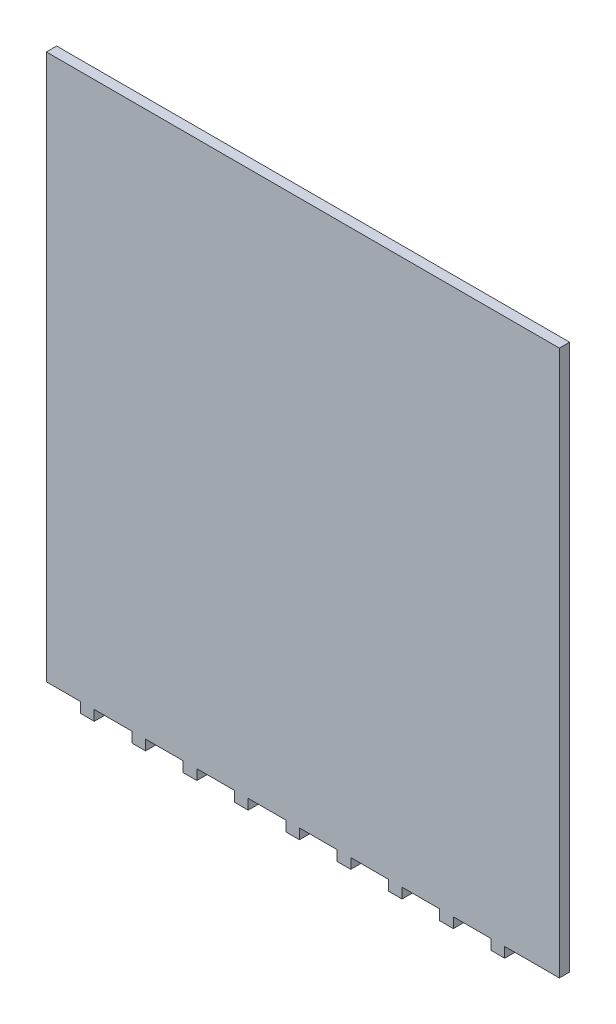
ISO-10303-21;
HEADER;
FILE_DESCRIPTION(('STEP AP214'),'2;1');
FILE_NAME('part.step','',(''),(''),'','','');
FILE_SCHEMA(('AUTOMOTIVE_DESIGN { 1 0 10303 214 1 1 1 1 }'));
ENDSEC;
DATA;
#1=APPLICATION_CONTEXT('core data for automotive mechanical design processes');
#2=APPLICATION_PROTOCOL_DEFINITION('international standard','automotive_design',2000,#1);
#3=PRODUCT_CONTEXT('',#1,'mechanical');
#4=PRODUCT('Part','Part','',(#3));
#5=PRODUCT_RELATED_PRODUCT_CATEGORY('part','',(#4));
#6=PRODUCT_DEFINITION_FORMATION('','',#4);
#7=PRODUCT_DEFINITION_CONTEXT('part definition',#1,'design');
#8=PRODUCT_DEFINITION('design','',#6,#7);
#9=PRODUCT_DEFINITION_SHAPE('','',#8);
#10=(LENGTH_UNIT() NAMED_UNIT(*) SI_UNIT(.MILLI.,.METRE.));
#11=(NAMED_UNIT(*) PLANE_ANGLE_UNIT() SI_UNIT($,.RADIAN.));
#12=(NAMED_UNIT(*) SI_UNIT($,.STERADIAN.) SOLID_ANGLE_UNIT());
#13=UNCERTAINTY_MEASURE_WITH_UNIT(LENGTH_MEASURE(1.E-05),#10,'distance_accuracy_value','');
#14=(GEOMETRIC_REPRESENTATION_CONTEXT(3) GLOBAL_UNCERTAINTY_ASSIGNED_CONTEXT((#13)) GLOBAL_UNIT_ASSIGNED_CONTEXT((#10,
#11,#12)) REPRESENTATION_CONTEXT('',''));
#15=CARTESIAN_POINT('',(0.,0.,0.));
#16=DIRECTION('',(0.,0.,1.));
#17=DIRECTION('',(1.,0.,0.));
#18=AXIS2_PLACEMENT_3D('',#15,#16,#17);
#19=CARTESIAN_POINT('',(0.,-325.,6.));
#20=DIRECTION('',(0.,1.,0.));
#21=DIRECTION('',(0.,0.,1.));
#22=AXIS2_PLACEMENT_3D('',#19,#20,#21);
#23=PLANE('',#22);
#24=DIRECTION('',(1.,0.,0.));
#25=VECTOR('',#24,1.);
#26=CARTESIAN_POINT('',(0.,-325.,6.));
#27=LINE('',#26,#25);
#28=CARTESIAN_POINT('',(260.,-325.,6.));
#29=VERTEX_POINT('',#28);
#30=CARTESIAN_POINT('',(268.,-325.,6.));
#31=VERTEX_POINT('',#30);
#32=EDGE_CURVE('E547',#29,#31,#27,.T.);
#33=ORIENTED_EDGE('',*,*,#32,.F.);
#34=DIRECTION('',(0.,0.,1.));
#35=VECTOR('',#34,1.);
#36=CARTESIAN_POINT('',(260.,-325.,0.));
#37=LINE('',#36,#35);
#38=CARTESIAN_POINT('',(260.,-325.,0.));
#39=VERTEX_POINT('',#38);
#40=EDGE_CURVE('E396',#39,#29,#37,.T.);
#41=ORIENTED_EDGE('',*,*,#40,.F.);
#42=DIRECTION('',(1.,0.,0.));
#43=VECTOR('',#42,1.);
#44=CARTESIAN_POINT('',(0.,-325.,0.));
#45=LINE('',#44,#43);
#46=CARTESIAN_POINT('',(268.,-325.,0.));
#47=VERTEX_POINT('',#46);
#48=EDGE_CURVE('E559',#39,#47,#45,.T.);
#49=ORIENTED_EDGE('',*,*,#48,.T.);
#50=DIRECTION('',(0.,0.,1.));
#51=VECTOR('',#50,1.);
#52=CARTESIAN_POINT('',(268.,-325.,0.));
#53=LINE('',#52,#51);
#54=EDGE_CURVE('E497',#47,#31,#53,.T.);
#55=ORIENTED_EDGE('',*,*,#54,.T.);
#56=EDGE_LOOP('',(#33,#41,#49,#55));
#57=FACE_BOUND('',#56,.T.);
#58=ADVANCED_FACE('F33',(#57),#23,.F.);
#59=CARTESIAN_POINT('',(230.,-325.,0.));
#60=VERTEX_POINT('',#59);
#61=CARTESIAN_POINT('',(238.,-325.,0.));
#62=VERTEX_POINT('',#61);
#63=EDGE_CURVE('E684',#60,#62,#45,.T.);
#64=ORIENTED_EDGE('',*,*,#63,.T.);
#65=DIRECTION('',(0.,0.,1.));
#66=VECTOR('',#65,1.);
#67=CARTESIAN_POINT('',(238.,-325.,0.));
#68=LINE('',#67,#66);
#69=CARTESIAN_POINT('',(238.,-325.,6.));
#70=VERTEX_POINT('',#69);
#71=EDGE_CURVE('E424',#62,#70,#68,.T.);
#72=ORIENTED_EDGE('',*,*,#71,.T.);
#73=CARTESIAN_POINT('',(230.,-325.,6.));
#74=VERTEX_POINT('',#73);
#75=EDGE_CURVE('E607',#74,#70,#27,.T.);
#76=ORIENTED_EDGE('',*,*,#75,.F.);
#77=DIRECTION('',(0.,0.,1.));
#78=VECTOR('',#77,1.);
#79=CARTESIAN_POINT('',(230.,-325.,0.));
#80=LINE('',#79,#78);
#81=EDGE_CURVE('E372',#60,#74,#80,.T.);
#82=ORIENTED_EDGE('',*,*,#81,.F.);
#83=EDGE_LOOP('',(#64,#72,#76,#82));
#84=FACE_BOUND('',#83,.T.);
#85=ADVANCED_FACE('F692',(#84),#23,.F.);
#86=CARTESIAN_POINT('',(200.,-325.,0.));
#87=VERTEX_POINT('',#86);
#88=CARTESIAN_POINT('',(208.,-325.,0.));
#89=VERTEX_POINT('',#88);
#90=EDGE_CURVE('E679',#87,#89,#45,.T.);
#91=ORIENTED_EDGE('',*,*,#90,.T.);
#92=DIRECTION('',(0.,0.,1.));
#93=VECTOR('',#92,1.);
#94=CARTESIAN_POINT('',(208.,-325.,0.));
#95=LINE('',#94,#93);
#96=CARTESIAN_POINT('',(208.,-325.,6.));
#97=VERTEX_POINT('',#96);
#98=EDGE_CURVE('E401',#89,#97,#95,.T.);
#99=ORIENTED_EDGE('',*,*,#98,.T.);
#100=CARTESIAN_POINT('',(200.,-325.,6.));
#101=VERTEX_POINT('',#100);
#102=EDGE_CURVE('E609',#101,#97,#27,.T.);
#103=ORIENTED_EDGE('',*,*,#102,.F.);
#104=DIRECTION('',(0.,0.,1.));
#105=VECTOR('',#104,1.);
#106=CARTESIAN_POINT('',(200.,-325.,0.));
#107=LINE('',#106,#105);
#108=EDGE_CURVE('E346',#87,#101,#107,.T.);
#109=ORIENTED_EDGE('',*,*,#108,.F.);
#110=EDGE_LOOP('',(#91,#99,#103,#109));
#111=FACE_BOUND('',#110,.T.);
#112=ADVANCED_FACE('F714',(#111),#23,.F.);
#113=CARTESIAN_POINT('',(170.,-325.,0.));
#114=VERTEX_POINT('',#113);
#115=CARTESIAN_POINT('',(178.,-325.,0.));
#116=VERTEX_POINT('',#115);
#117=EDGE_CURVE('E676',#114,#116,#45,.T.);
#118=ORIENTED_EDGE('',*,*,#117,.T.);
#119=DIRECTION('',(0.,0.,1.));
#120=VECTOR('',#119,1.);
#121=CARTESIAN_POINT('',(178.,-325.,0.));
#122=LINE('',#121,#120);
#123=CARTESIAN_POINT('',(178.,-325.,6.));
#124=VERTEX_POINT('',#123);
#125=EDGE_CURVE('E377',#116,#124,#122,.T.);
#126=ORIENTED_EDGE('',*,*,#125,.T.);
#127=CARTESIAN_POINT('',(170.,-325.,6.));
#128=VERTEX_POINT('',#127);
#129=EDGE_CURVE('E614',#128,#124,#27,.T.);
#130=ORIENTED_EDGE('',*,*,#129,.F.);
#131=DIRECTION('',(0.,0.,1.));
#132=VECTOR('',#131,1.);
#133=CARTESIAN_POINT('',(170.,-325.,0.));
#134=LINE('',#133,#132);
#135=EDGE_CURVE('E323',#114,#128,#134,.T.);
#136=ORIENTED_EDGE('',*,*,#135,.F.);
#137=EDGE_LOOP('',(#118,#126,#130,#136));
#138=FACE_BOUND('',#137,.T.);
#139=ADVANCED_FACE('F733',(#138),#23,.F.);
#140=CARTESIAN_POINT('',(140.,-325.,0.));
#141=VERTEX_POINT('',#140);
#142=CARTESIAN_POINT('',(148.,-325.,0.));
#143=VERTEX_POINT('',#142);
#144=EDGE_CURVE('E315',#141,#143,#45,.T.);
#145=ORIENTED_EDGE('',*,*,#144,.T.);
#146=DIRECTION('',(0.,0.,1.));
#147=VECTOR('',#146,1.);
#148=CARTESIAN_POINT('',(148.,-325.,0.));
#149=LINE('',#148,#147);
#150=CARTESIAN_POINT('',(148.,-325.,6.));
#151=VERTEX_POINT('',#150);
#152=EDGE_CURVE('E351',#143,#151,#149,.T.);
#153=ORIENTED_EDGE('',*,*,#152,.T.);
#154=CARTESIAN_POINT('',(140.,-325.,6.));
#155=VERTEX_POINT('',#154);
#156=EDGE_CURVE('E619',#155,#151,#27,.T.);
#157=ORIENTED_EDGE('',*,*,#156,.F.);
#158=DIRECTION('',(0.,0.,1.));
#159=VECTOR('',#158,1.);
#160=CARTESIAN_POINT('',(140.,-325.,0.));
#161=LINE('',#160,#159);
#162=EDGE_CURVE('E325',#141,#155,#161,.T.);
#163=ORIENTED_EDGE('',*,*,#162,.F.);
#164=EDGE_LOOP('',(#145,#153,#157,#163));
#165=FACE_BOUND('',#164,.T.);
#166=ADVANCED_FACE('F729',(#165),#23,.F.);
#167=CARTESIAN_POINT('',(50.,-325.,6.));
#168=VERTEX_POINT('',#167);
#169=CARTESIAN_POINT('',(58.,-325.,6.));
#170=VERTEX_POINT('',#169);
#171=EDGE_CURVE('E553',#168,#170,#27,.T.);
#172=ORIENTED_EDGE('',*,*,#171,.F.);
#173=DIRECTION('',(0.,0.,1.));
#174=VECTOR('',#173,1.);
#175=CARTESIAN_POINT('',(50.,-325.,0.));
#176=LINE('',#175,#174);
#177=CARTESIAN_POINT('',(50.,-325.,0.));
#178=VERTEX_POINT('',#177);
#179=EDGE_CURVE('E501',#178,#168,#176,.T.);
#180=ORIENTED_EDGE('',*,*,#179,.F.);
#181=CARTESIAN_POINT('',(58.,-325.,0.));
#182=VERTEX_POINT('',#181);
#183=EDGE_CURVE('E564',#178,#182,#45,.T.);
#184=ORIENTED_EDGE('',*,*,#183,.T.);
#185=DIRECTION('',(0.,0.,1.));
#186=VECTOR('',#185,1.);
#187=CARTESIAN_POINT('',(58.,-325.,0.));
#188=LINE('',#187,#186);
#189=EDGE_CURVE('E452',#182,#170,#188,.T.);
#190=ORIENTED_EDGE('',*,*,#189,.T.);
#191=EDGE_LOOP('',(#172,#180,#184,#190));
#192=FACE_BOUND('',#191,.T.);
#193=ADVANCED_FACE('F644',(#192),#23,.F.);
#194=CARTESIAN_POINT('',(80.,-325.,6.));
#195=VERTEX_POINT('',#194);
#196=CARTESIAN_POINT('',(88.,-325.,6.));
#197=VERTEX_POINT('',#196);
#198=EDGE_CURVE('E628',#195,#197,#27,.T.);
#199=ORIENTED_EDGE('',*,*,#198,.F.);
#200=DIRECTION('',(0.,0.,1.));
#201=VECTOR('',#200,1.);
#202=CARTESIAN_POINT('',(80.,-325.,0.));
#203=LINE('',#202,#201);
#204=CARTESIAN_POINT('',(80.,-325.,0.));
#205=VERTEX_POINT('',#204);
#206=EDGE_CURVE('E449',#205,#195,#203,.T.);
#207=ORIENTED_EDGE('',*,*,#206,.F.);
#208=CARTESIAN_POINT('',(88.,-325.,0.));
#209=VERTEX_POINT('',#208);
#210=EDGE_CURVE('E659',#205,#209,#45,.T.);
#211=ORIENTED_EDGE('',*,*,#210,.T.);
#212=DIRECTION('',(0.,0.,1.));
#213=VECTOR('',#212,1.);
#214=CARTESIAN_POINT('',(88.,-325.,0.));
#215=LINE('',#214,#213);
#216=EDGE_CURVE('E476',#209,#197,#215,.T.);
#217=ORIENTED_EDGE('',*,*,#216,.T.);
#218=EDGE_LOOP('',(#199,#207,#211,#217));
#219=FACE_BOUND('',#218,.T.);
#220=ADVANCED_FACE('F657',(#219),#23,.F.);
#221=CARTESIAN_POINT('',(110.,-325.,0.));
#222=VERTEX_POINT('',#221);
#223=CARTESIAN_POINT('',(118.,-325.,0.));
#224=VERTEX_POINT('',#223);
#225=EDGE_CURVE('E673',#222,#224,#45,.T.);
#226=ORIENTED_EDGE('',*,*,#225,.T.);
#227=DIRECTION('',(0.,0.,1.));
#228=VECTOR('',#227,1.);
#229=CARTESIAN_POINT('',(118.,-325.,0.));
#230=LINE('',#229,#228);
#231=CARTESIAN_POINT('',(118.,-325.,6.));
#232=VERTEX_POINT('',#231);
#233=EDGE_CURVE('E328',#224,#232,#230,.T.);
#234=ORIENTED_EDGE('',*,*,#233,.T.);
#235=CARTESIAN_POINT('',(110.,-325.,6.));
#236=VERTEX_POINT('',#235);
#237=EDGE_CURVE('E624',#236,#232,#27,.T.);
#238=ORIENTED_EDGE('',*,*,#237,.F.);
#239=DIRECTION('',(0.,0.,1.));
#240=VECTOR('',#239,1.);
#241=CARTESIAN_POINT('',(110.,-325.,0.));
#242=LINE('',#241,#240);
#243=EDGE_CURVE('E445',#222,#236,#242,.T.);
#244=ORIENTED_EDGE('',*,*,#243,.F.);
#245=EDGE_LOOP('',(#226,#234,#238,#244));
#246=FACE_BOUND('',#245,.T.);
#247=ADVANCED_FACE('F672',(#246),#23,.F.);
#248=CARTESIAN_POINT('',(0.,0.,6.));
#249=DIRECTION('',(1.,0.,0.));
#250=DIRECTION('',(0.,0.,-1.));
#251=AXIS2_PLACEMENT_3D('',#248,#249,#250);
#252=PLANE('',#251);
#253=DIRECTION('',(0.,-1.,0.));
#254=VECTOR('',#253,1.);
#255=CARTESIAN_POINT('',(0.,0.,0.));
#256=LINE('',#255,#254);
#257=CARTESIAN_POINT('',(0.,0.,0.));
#258=VERTEX_POINT('',#257);
#259=CARTESIAN_POINT('',(0.,-319.,0.));
#260=VERTEX_POINT('',#259);
#261=EDGE_CURVE('E539',#258,#260,#256,.T.);
#262=ORIENTED_EDGE('',*,*,#261,.T.);
#263=DIRECTION('',(0.,0.,1.));
#264=VECTOR('',#263,1.);
#265=CARTESIAN_POINT('',(0.,-319.,0.));
#266=LINE('',#265,#264);
#267=CARTESIAN_POINT('',(0.,-319.,6.));
#268=VERTEX_POINT('',#267);
#269=EDGE_CURVE('E533',#260,#268,#266,.T.);
#270=ORIENTED_EDGE('',*,*,#269,.T.);
#271=DIRECTION('',(0.,-1.,0.));
#272=VECTOR('',#271,1.);
#273=CARTESIAN_POINT('',(0.,0.,6.));
#274=LINE('',#273,#272);
#275=CARTESIAN_POINT('',(0.,0.,6.));
#276=VERTEX_POINT('',#275);
#277=EDGE_CURVE('E544',#276,#268,#274,.T.);
#278=ORIENTED_EDGE('',*,*,#277,.F.);
#279=DIRECTION('',(0.,0.,-1.));
#280=VECTOR('',#279,1.);
#281=CARTESIAN_POINT('',(0.,0.,6.));
#282=LINE('',#281,#280);
#283=EDGE_CURVE('E41',#276,#258,#282,.T.);
#284=ORIENTED_EDGE('',*,*,#283,.T.);
#285=EDGE_LOOP('',(#262,#270,#278,#284));
#286=FACE_BOUND('',#285,.T.);
#287=ADVANCED_FACE('F35',(#286),#252,.F.);
#288=CARTESIAN_POINT('',(20.,-325.,0.));
#289=VERTEX_POINT('',#288);
#290=CARTESIAN_POINT('',(28.,-325.,0.));
#291=VERTEX_POINT('',#290);
#292=EDGE_CURVE('E560',#289,#291,#45,.T.);
#293=ORIENTED_EDGE('',*,*,#292,.T.);
#294=DIRECTION('',(0.,0.,1.));
#295=VECTOR('',#294,1.);
#296=CARTESIAN_POINT('',(28.,-325.,0.));
#297=LINE('',#296,#295);
#298=CARTESIAN_POINT('',(28.,-325.,6.));
#299=VERTEX_POINT('',#298);
#300=EDGE_CURVE('E504',#291,#299,#297,.T.);
#301=ORIENTED_EDGE('',*,*,#300,.T.);
#302=CARTESIAN_POINT('',(20.,-325.,6.));
#303=VERTEX_POINT('',#302);
#304=EDGE_CURVE('E549',#303,#299,#27,.T.);
#305=ORIENTED_EDGE('',*,*,#304,.F.);
#306=DIRECTION('',(0.,0.,1.));
#307=VECTOR('',#306,1.);
#308=CARTESIAN_POINT('',(20.,-325.,0.));
#309=LINE('',#308,#307);
#310=EDGE_CURVE('E540',#289,#303,#309,.T.);
#311=ORIENTED_EDGE('',*,*,#310,.F.);
#312=EDGE_LOOP('',(#293,#301,#305,#311));
#313=FACE_BOUND('',#312,.T.);
#314=ADVANCED_FACE('F710',(#313),#23,.F.);
#315=CARTESIAN_POINT('',(300.,0.,6.));
#316=DIRECTION('',(-1.,0.,0.));
#317=DIRECTION('',(0.,0.,1.));
#318=AXIS2_PLACEMENT_3D('',#315,#316,#317);
#319=PLANE('',#318);
#320=DIRECTION('',(0.,1.,0.));
#321=VECTOR('',#320,1.);
#322=CARTESIAN_POINT('',(300.,0.,6.));
#323=LINE('',#322,#321);
#324=CARTESIAN_POINT('',(300.,-319.,6.));
#325=VERTEX_POINT('',#324);
#326=CARTESIAN_POINT('',(300.,0.,6.));
#327=VERTEX_POINT('',#326);
#328=EDGE_CURVE('E552',#325,#327,#323,.T.);
#329=ORIENTED_EDGE('',*,*,#328,.F.);
#330=DIRECTION('',(0.,0.,1.));
#331=VECTOR('',#330,1.);
#332=CARTESIAN_POINT('',(300.,-319.,0.));
#333=LINE('',#332,#331);
#334=CARTESIAN_POINT('',(300.,-319.,0.));
#335=VERTEX_POINT('',#334);
#336=EDGE_CURVE('E517',#335,#325,#333,.T.);
#337=ORIENTED_EDGE('',*,*,#336,.F.);
#338=DIRECTION('',(0.,1.,0.));
#339=VECTOR('',#338,1.);
#340=CARTESIAN_POINT('',(300.,0.,0.));
#341=LINE('',#340,#339);
#342=CARTESIAN_POINT('',(300.,0.,0.));
#343=VERTEX_POINT('',#342);
#344=EDGE_CURVE('E563',#335,#343,#341,.T.);
#345=ORIENTED_EDGE('',*,*,#344,.T.);
#346=DIRECTION('',(0.,0.,-1.));
#347=VECTOR('',#346,1.);
#348=CARTESIAN_POINT('',(300.,0.,6.));
#349=LINE('',#348,#347);
#350=EDGE_CURVE('E11',#327,#343,#349,.T.);
#351=ORIENTED_EDGE('',*,*,#350,.F.);
#352=EDGE_LOOP('',(#329,#337,#345,#351));
#353=FACE_BOUND('',#352,.T.);
#354=ADVANCED_FACE('F593',(#353),#319,.F.);
#355=CARTESIAN_POINT('',(0.,0.,6.));
#356=DIRECTION('',(0.,-1.,0.));
#357=DIRECTION('',(0.,0.,-1.));
#358=AXIS2_PLACEMENT_3D('',#355,#356,#357);
#359=PLANE('',#358);
#360=DIRECTION('',(-1.,0.,0.));
#361=VECTOR('',#360,1.);
#362=CARTESIAN_POINT('',(0.,0.,0.));
#363=LINE('',#362,#361);
#364=EDGE_CURVE('E548',#343,#258,#363,.T.);
#365=ORIENTED_EDGE('',*,*,#364,.T.);
#366=ORIENTED_EDGE('',*,*,#283,.F.);
#367=DIRECTION('',(-1.,0.,0.));
#368=VECTOR('',#367,1.);
#369=CARTESIAN_POINT('',(0.,0.,6.));
#370=LINE('',#369,#368);
#371=EDGE_CURVE('E555',#327,#276,#370,.T.);
#372=ORIENTED_EDGE('',*,*,#371,.F.);
#373=ORIENTED_EDGE('',*,*,#350,.T.);
#374=EDGE_LOOP('',(#365,#366,#372,#373));
#375=FACE_BOUND('',#374,.T.);
#376=ADVANCED_FACE('F591',(#375),#359,.F.);
#377=CARTESIAN_POINT('',(0.,0.,6.));
#378=DIRECTION('',(0.,0.,1.));
#379=DIRECTION('',(1.,0.,0.));
#380=AXIS2_PLACEMENT_3D('',#377,#378,#379);
#381=PLANE('',#380);
#382=DIRECTION('',(0.,1.,0.));
#383=VECTOR('',#382,1.);
#384=CARTESIAN_POINT('',(260.,-319.,6.));
#385=LINE('',#384,#383);
#386=CARTESIAN_POINT('',(260.,-319.,6.));
#387=VERTEX_POINT('',#386);
#388=EDGE_CURVE('E416',#29,#387,#385,.T.);
#389=ORIENTED_EDGE('',*,*,#388,.F.);
#390=ORIENTED_EDGE('',*,*,#32,.T.);
#391=DIRECTION('',(0.,-1.,0.));
#392=VECTOR('',#391,1.);
#393=CARTESIAN_POINT('',(268.,-319.,6.));
#394=LINE('',#393,#392);
#395=CARTESIAN_POINT('',(268.,-319.,6.));
#396=VERTEX_POINT('',#395);
#397=EDGE_CURVE('E514',#396,#31,#394,.T.);
#398=ORIENTED_EDGE('',*,*,#397,.F.);
#399=DIRECTION('',(-1.,0.,0.));
#400=VECTOR('',#399,1.);
#401=CARTESIAN_POINT('',(268.,-319.,6.));
#402=LINE('',#401,#400);
#403=EDGE_CURVE('E451',#325,#396,#402,.T.);
#404=ORIENTED_EDGE('',*,*,#403,.F.);
#405=ORIENTED_EDGE('',*,*,#328,.T.);
#406=ORIENTED_EDGE('',*,*,#371,.T.);
#407=ORIENTED_EDGE('',*,*,#277,.T.);
#408=DIRECTION('',(-1.,0.,0.));
#409=VECTOR('',#408,1.);
#410=CARTESIAN_POINT('',(20.,-319.,6.));
#411=LINE('',#410,#409);
#412=CARTESIAN_POINT('',(20.,-319.,6.));
#413=VERTEX_POINT('',#412);
#414=EDGE_CURVE('E503',#413,#268,#411,.T.);
#415=ORIENTED_EDGE('',*,*,#414,.F.);
#416=DIRECTION('',(0.,1.,0.));
#417=VECTOR('',#416,1.);
#418=CARTESIAN_POINT('',(20.,-325.,6.));
#419=LINE('',#418,#417);
#420=EDGE_CURVE('E530',#303,#413,#419,.T.);
#421=ORIENTED_EDGE('',*,*,#420,.F.);
#422=ORIENTED_EDGE('',*,*,#304,.T.);
#423=DIRECTION('',(0.,-1.,0.));
#424=VECTOR('',#423,1.);
#425=CARTESIAN_POINT('',(28.,-319.,6.));
#426=LINE('',#425,#424);
#427=CARTESIAN_POINT('',(28.,-319.,6.));
#428=VERTEX_POINT('',#427);
#429=EDGE_CURVE('E486',#428,#299,#426,.T.);
#430=ORIENTED_EDGE('',*,*,#429,.F.);
#431=DIRECTION('',(-1.,0.,0.));
#432=VECTOR('',#431,1.);
#433=CARTESIAN_POINT('',(28.,-319.,6.));
#434=LINE('',#433,#432);
#435=CARTESIAN_POINT('',(50.,-319.,6.));
#436=VERTEX_POINT('',#435);
#437=EDGE_CURVE('E496',#436,#428,#434,.T.);
#438=ORIENTED_EDGE('',*,*,#437,.F.);
#439=DIRECTION('',(0.,1.,0.));
#440=VECTOR('',#439,1.);
#441=CARTESIAN_POINT('',(50.,-319.,6.));
#442=LINE('',#441,#440);
#443=EDGE_CURVE('E493',#168,#436,#442,.T.);
#444=ORIENTED_EDGE('',*,*,#443,.F.);
#445=ORIENTED_EDGE('',*,*,#171,.T.);
#446=DIRECTION('',(0.,-1.,0.));
#447=VECTOR('',#446,1.);
#448=CARTESIAN_POINT('',(58.,-319.,6.));
#449=LINE('',#448,#447);
#450=CARTESIAN_POINT('',(58.,-319.,6.));
#451=VERTEX_POINT('',#450);
#452=EDGE_CURVE('E434',#451,#170,#449,.T.);
#453=ORIENTED_EDGE('',*,*,#452,.F.);
#454=DIRECTION('',(-1.,0.,0.));
#455=VECTOR('',#454,1.);
#456=CARTESIAN_POINT('',(58.,-319.,6.));
#457=LINE('',#456,#455);
#458=CARTESIAN_POINT('',(80.,-319.,6.));
#459=VERTEX_POINT('',#458);
#460=EDGE_CURVE('E444',#459,#451,#457,.T.);
#461=ORIENTED_EDGE('',*,*,#460,.F.);
#462=DIRECTION('',(0.,1.,0.));
#463=VECTOR('',#462,1.);
#464=CARTESIAN_POINT('',(80.,-319.,6.));
#465=LINE('',#464,#463);
#466=EDGE_CURVE('E441',#195,#459,#465,.T.);
#467=ORIENTED_EDGE('',*,*,#466,.F.);
#468=ORIENTED_EDGE('',*,*,#198,.T.);
#469=DIRECTION('',(0.,-1.,0.));
#470=VECTOR('',#469,1.);
#471=CARTESIAN_POINT('',(88.,-319.,6.));
#472=LINE('',#471,#470);
#473=CARTESIAN_POINT('',(88.,-319.,6.));
#474=VERTEX_POINT('',#473);
#475=EDGE_CURVE('E462',#474,#197,#472,.T.);
#476=ORIENTED_EDGE('',*,*,#475,.F.);
#477=DIRECTION('',(-1.,0.,0.));
#478=VECTOR('',#477,1.);
#479=CARTESIAN_POINT('',(88.,-319.,6.));
#480=LINE('',#479,#478);
#481=CARTESIAN_POINT('',(110.,-319.,6.));
#482=VERTEX_POINT('',#481);
#483=EDGE_CURVE('E471',#482,#474,#480,.T.);
#484=ORIENTED_EDGE('',*,*,#483,.F.);
#485=DIRECTION('',(0.,1.,0.));
#486=VECTOR('',#485,1.);
#487=CARTESIAN_POINT('',(110.,-319.,6.));
#488=LINE('',#487,#486);
#489=EDGE_CURVE('E327',#236,#482,#488,.T.);
#490=ORIENTED_EDGE('',*,*,#489,.F.);
#491=ORIENTED_EDGE('',*,*,#237,.T.);
#492=DIRECTION('',(0.,-1.,0.));
#493=VECTOR('',#492,1.);
#494=CARTESIAN_POINT('',(118.,-319.,6.));
#495=LINE('',#494,#493);
#496=CARTESIAN_POINT('',(118.,-319.,6.));
#497=VERTEX_POINT('',#496);
#498=EDGE_CURVE('E316',#497,#232,#495,.T.);
#499=ORIENTED_EDGE('',*,*,#498,.F.);
#500=DIRECTION('',(-1.,0.,0.));
#501=VECTOR('',#500,1.);
#502=CARTESIAN_POINT('',(118.,-319.,6.));
#503=LINE('',#502,#501);
#504=CARTESIAN_POINT('',(140.,-319.,6.));
#505=VERTEX_POINT('',#504);
#506=EDGE_CURVE('E318',#505,#497,#503,.T.);
#507=ORIENTED_EDGE('',*,*,#506,.F.);
#508=DIRECTION('',(0.,1.,0.));
#509=VECTOR('',#508,1.);
#510=CARTESIAN_POINT('',(140.,-319.,6.));
#511=LINE('',#510,#509);
#512=EDGE_CURVE('E296',#155,#505,#511,.T.);
#513=ORIENTED_EDGE('',*,*,#512,.F.);
#514=ORIENTED_EDGE('',*,*,#156,.T.);
#515=DIRECTION('',(0.,-1.,0.));
#516=VECTOR('',#515,1.);
#517=CARTESIAN_POINT('',(148.,-319.,6.));
#518=LINE('',#517,#516);
#519=CARTESIAN_POINT('',(148.,-319.,6.));
#520=VERTEX_POINT('',#519);
#521=EDGE_CURVE('E336',#520,#151,#518,.T.);
#522=ORIENTED_EDGE('',*,*,#521,.F.);
#523=DIRECTION('',(-1.,0.,0.));
#524=VECTOR('',#523,1.);
#525=CARTESIAN_POINT('',(148.,-319.,6.));
#526=LINE('',#525,#524);
#527=CARTESIAN_POINT('',(170.,-319.,6.));
#528=VERTEX_POINT('',#527);
#529=EDGE_CURVE('E345',#528,#520,#526,.T.);
#530=ORIENTED_EDGE('',*,*,#529,.F.);
#531=DIRECTION('',(0.,1.,0.));
#532=VECTOR('',#531,1.);
#533=CARTESIAN_POINT('',(170.,-319.,6.));
#534=LINE('',#533,#532);
#535=EDGE_CURVE('E342',#128,#528,#534,.T.);
#536=ORIENTED_EDGE('',*,*,#535,.F.);
#537=ORIENTED_EDGE('',*,*,#129,.T.);
#538=DIRECTION('',(0.,-1.,0.));
#539=VECTOR('',#538,1.);
#540=CARTESIAN_POINT('',(178.,-319.,6.));
#541=LINE('',#540,#539);
#542=CARTESIAN_POINT('',(178.,-319.,6.));
#543=VERTEX_POINT('',#542);
#544=EDGE_CURVE('E361',#543,#124,#541,.T.);
#545=ORIENTED_EDGE('',*,*,#544,.F.);
#546=DIRECTION('',(-1.,0.,0.));
#547=VECTOR('',#546,1.);
#548=CARTESIAN_POINT('',(178.,-319.,6.));
#549=LINE('',#548,#547);
#550=CARTESIAN_POINT('',(200.,-319.,6.));
#551=VERTEX_POINT('',#550);
#552=EDGE_CURVE('E371',#551,#543,#549,.T.);
#553=ORIENTED_EDGE('',*,*,#552,.F.);
#554=DIRECTION('',(0.,1.,0.));
#555=VECTOR('',#554,1.);
#556=CARTESIAN_POINT('',(200.,-319.,6.));
#557=LINE('',#556,#555);
#558=EDGE_CURVE('E368',#101,#551,#557,.T.);
#559=ORIENTED_EDGE('',*,*,#558,.F.);
#560=ORIENTED_EDGE('',*,*,#102,.T.);
#561=DIRECTION('',(0.,-1.,0.));
#562=VECTOR('',#561,1.);
#563=CARTESIAN_POINT('',(208.,-319.,6.));
#564=LINE('',#563,#562);
#565=CARTESIAN_POINT('',(208.,-319.,6.));
#566=VERTEX_POINT('',#565);
#567=EDGE_CURVE('E387',#566,#97,#564,.T.);
#568=ORIENTED_EDGE('',*,*,#567,.F.);
#569=DIRECTION('',(-1.,0.,0.));
#570=VECTOR('',#569,1.);
#571=CARTESIAN_POINT('',(208.,-319.,6.));
#572=LINE('',#571,#570);
#573=CARTESIAN_POINT('',(230.,-319.,6.));
#574=VERTEX_POINT('',#573);
#575=EDGE_CURVE('E395',#574,#566,#572,.T.);
#576=ORIENTED_EDGE('',*,*,#575,.F.);
#577=DIRECTION('',(0.,1.,0.));
#578=VECTOR('',#577,1.);
#579=CARTESIAN_POINT('',(230.,-319.,6.));
#580=LINE('',#579,#578);
#581=EDGE_CURVE('E392',#74,#574,#580,.T.);
#582=ORIENTED_EDGE('',*,*,#581,.F.);
#583=ORIENTED_EDGE('',*,*,#75,.T.);
#584=DIRECTION('',(0.,-1.,0.));
#585=VECTOR('',#584,1.);
#586=CARTESIAN_POINT('',(238.,-319.,6.));
#587=LINE('',#586,#585);
#588=CARTESIAN_POINT('',(238.,-319.,6.));
#589=VERTEX_POINT('',#588);
#590=EDGE_CURVE('E411',#589,#70,#587,.T.);
#591=ORIENTED_EDGE('',*,*,#590,.F.);
#592=DIRECTION('',(-1.,0.,0.));
#593=VECTOR('',#592,1.);
#594=CARTESIAN_POINT('',(238.,-319.,6.));
#595=LINE('',#594,#593);
#596=EDGE_CURVE('E419',#387,#589,#595,.T.);
#597=ORIENTED_EDGE('',*,*,#596,.F.);
#598=EDGE_LOOP('',(#389,#390,#398,#404,#405,#406,#407,#415,#421,#422,#430,#438,#444,#445,#453,
#461,#467,#468,#476,#484,#490,#491,#499,#507,#513,#514,#522,#530,#536,#537,#545,#553,#559,#560,
#568,#576,#582,#583,#591,#597));
#599=FACE_BOUND('',#598,.T.);
#600=ADVANCED_FACE('F587',(#599),#381,.T.);
#601=CARTESIAN_POINT('',(0.,0.,0.));
#602=DIRECTION('',(0.,0.,1.));
#603=DIRECTION('',(1.,0.,0.));
#604=AXIS2_PLACEMENT_3D('',#601,#602,#603);
#605=PLANE('',#604);
#606=ORIENTED_EDGE('',*,*,#48,.F.);
#607=DIRECTION('',(0.,1.,0.));
#608=VECTOR('',#607,1.);
#609=CARTESIAN_POINT('',(260.,-319.,0.));
#610=LINE('',#609,#608);
#611=CARTESIAN_POINT('',(260.,-319.,0.));
#612=VERTEX_POINT('',#611);
#613=EDGE_CURVE('E407',#39,#612,#610,.T.);
#614=ORIENTED_EDGE('',*,*,#613,.T.);
#615=DIRECTION('',(-1.,0.,0.));
#616=VECTOR('',#615,1.);
#617=CARTESIAN_POINT('',(238.,-319.,0.));
#618=LINE('',#617,#616);
#619=CARTESIAN_POINT('',(238.,-319.,0.));
#620=VERTEX_POINT('',#619);
#621=EDGE_CURVE('E410',#612,#620,#618,.T.);
#622=ORIENTED_EDGE('',*,*,#621,.T.);
#623=DIRECTION('',(0.,-1.,0.));
#624=VECTOR('',#623,1.);
#625=CARTESIAN_POINT('',(238.,-319.,0.));
#626=LINE('',#625,#624);
#627=EDGE_CURVE('E48',#620,#62,#626,.T.);
#628=ORIENTED_EDGE('',*,*,#627,.T.);
#629=ORIENTED_EDGE('',*,*,#63,.F.);
#630=DIRECTION('',(0.,1.,0.));
#631=VECTOR('',#630,1.);
#632=CARTESIAN_POINT('',(230.,-319.,0.));
#633=LINE('',#632,#631);
#634=CARTESIAN_POINT('',(230.,-319.,0.));
#635=VERTEX_POINT('',#634);
#636=EDGE_CURVE('E383',#60,#635,#633,.T.);
#637=ORIENTED_EDGE('',*,*,#636,.T.);
#638=DIRECTION('',(-1.,0.,0.));
#639=VECTOR('',#638,1.);
#640=CARTESIAN_POINT('',(208.,-319.,0.));
#641=LINE('',#640,#639);
#642=CARTESIAN_POINT('',(208.,-319.,0.));
#643=VERTEX_POINT('',#642);
#644=EDGE_CURVE('E386',#635,#643,#641,.T.);
#645=ORIENTED_EDGE('',*,*,#644,.T.);
#646=DIRECTION('',(0.,-1.,0.));
#647=VECTOR('',#646,1.);
#648=CARTESIAN_POINT('',(208.,-319.,0.));
#649=LINE('',#648,#647);
#650=EDGE_CURVE('E56',#643,#89,#649,.T.);
#651=ORIENTED_EDGE('',*,*,#650,.T.);
#652=ORIENTED_EDGE('',*,*,#90,.F.);
#653=DIRECTION('',(0.,1.,0.));
#654=VECTOR('',#653,1.);
#655=CARTESIAN_POINT('',(200.,-319.,0.));
#656=LINE('',#655,#654);
#657=CARTESIAN_POINT('',(200.,-319.,0.));
#658=VERTEX_POINT('',#657);
#659=EDGE_CURVE('E357',#87,#658,#656,.T.);
#660=ORIENTED_EDGE('',*,*,#659,.T.);
#661=DIRECTION('',(-1.,0.,0.));
#662=VECTOR('',#661,1.);
#663=CARTESIAN_POINT('',(178.,-319.,0.));
#664=LINE('',#663,#662);
#665=CARTESIAN_POINT('',(178.,-319.,0.));
#666=VERTEX_POINT('',#665);
#667=EDGE_CURVE('E360',#658,#666,#664,.T.);
#668=ORIENTED_EDGE('',*,*,#667,.T.);
#669=DIRECTION('',(0.,-1.,0.));
#670=VECTOR('',#669,1.);
#671=CARTESIAN_POINT('',(178.,-319.,0.));
#672=LINE('',#671,#670);
#673=EDGE_CURVE('E364',#666,#116,#672,.T.);
#674=ORIENTED_EDGE('',*,*,#673,.T.);
#675=ORIENTED_EDGE('',*,*,#117,.F.);
#676=DIRECTION('',(0.,1.,0.));
#677=VECTOR('',#676,1.);
#678=CARTESIAN_POINT('',(170.,-319.,0.));
#679=LINE('',#678,#677);
#680=CARTESIAN_POINT('',(170.,-319.,0.));
#681=VERTEX_POINT('',#680);
#682=EDGE_CURVE('E332',#114,#681,#679,.T.);
#683=ORIENTED_EDGE('',*,*,#682,.T.);
#684=DIRECTION('',(-1.,0.,0.));
#685=VECTOR('',#684,1.);
#686=CARTESIAN_POINT('',(148.,-319.,0.));
#687=LINE('',#686,#685);
#688=CARTESIAN_POINT('',(148.,-319.,0.));
#689=VERTEX_POINT('',#688);
#690=EDGE_CURVE('E335',#681,#689,#687,.T.);
#691=ORIENTED_EDGE('',*,*,#690,.T.);
#692=DIRECTION('',(0.,-1.,0.));
#693=VECTOR('',#692,1.);
#694=CARTESIAN_POINT('',(148.,-319.,0.));
#695=LINE('',#694,#693);
#696=EDGE_CURVE('E339',#689,#143,#695,.T.);
#697=ORIENTED_EDGE('',*,*,#696,.T.);
#698=ORIENTED_EDGE('',*,*,#144,.F.);
#699=DIRECTION('',(0.,1.,0.));
#700=VECTOR('',#699,1.);
#701=CARTESIAN_POINT('',(140.,-319.,0.));
#702=LINE('',#701,#700);
#703=CARTESIAN_POINT('',(140.,-319.,0.));
#704=VERTEX_POINT('',#703);
#705=EDGE_CURVE('E293',#141,#704,#702,.T.);
#706=ORIENTED_EDGE('',*,*,#705,.T.);
#707=DIRECTION('',(-1.,0.,0.));
#708=VECTOR('',#707,1.);
#709=CARTESIAN_POINT('',(118.,-319.,0.));
#710=LINE('',#709,#708);
#711=CARTESIAN_POINT('',(118.,-319.,0.));
#712=VERTEX_POINT('',#711);
#713=EDGE_CURVE('E305',#704,#712,#710,.T.);
#714=ORIENTED_EDGE('',*,*,#713,.T.);
#715=DIRECTION('',(0.,-1.,0.));
#716=VECTOR('',#715,1.);
#717=CARTESIAN_POINT('',(118.,-319.,0.));
#718=LINE('',#717,#716);
#719=EDGE_CURVE('E301',#712,#224,#718,.T.);
#720=ORIENTED_EDGE('',*,*,#719,.T.);
#721=ORIENTED_EDGE('',*,*,#225,.F.);
#722=DIRECTION('',(0.,1.,0.));
#723=VECTOR('',#722,1.);
#724=CARTESIAN_POINT('',(110.,-319.,0.));
#725=LINE('',#724,#723);
#726=CARTESIAN_POINT('',(110.,-319.,0.));
#727=VERTEX_POINT('',#726);
#728=EDGE_CURVE('E458',#222,#727,#725,.T.);
#729=ORIENTED_EDGE('',*,*,#728,.T.);
#730=DIRECTION('',(-1.,0.,0.));
#731=VECTOR('',#730,1.);
#732=CARTESIAN_POINT('',(88.,-319.,0.));
#733=LINE('',#732,#731);
#734=CARTESIAN_POINT('',(88.,-319.,0.));
#735=VERTEX_POINT('',#734);
#736=EDGE_CURVE('E461',#727,#735,#733,.T.);
#737=ORIENTED_EDGE('',*,*,#736,.T.);
#738=DIRECTION('',(0.,-1.,0.));
#739=VECTOR('',#738,1.);
#740=CARTESIAN_POINT('',(88.,-319.,0.));
#741=LINE('',#740,#739);
#742=EDGE_CURVE('E465',#735,#209,#741,.T.);
#743=ORIENTED_EDGE('',*,*,#742,.T.);
#744=ORIENTED_EDGE('',*,*,#210,.F.);
#745=DIRECTION('',(0.,1.,0.));
#746=VECTOR('',#745,1.);
#747=CARTESIAN_POINT('',(80.,-319.,0.));
#748=LINE('',#747,#746);
#749=CARTESIAN_POINT('',(80.,-319.,0.));
#750=VERTEX_POINT('',#749);
#751=EDGE_CURVE('E430',#205,#750,#748,.T.);
#752=ORIENTED_EDGE('',*,*,#751,.T.);
#753=DIRECTION('',(-1.,0.,0.));
#754=VECTOR('',#753,1.);
#755=CARTESIAN_POINT('',(58.,-319.,0.));
#756=LINE('',#755,#754);
#757=CARTESIAN_POINT('',(58.,-319.,0.));
#758=VERTEX_POINT('',#757);
#759=EDGE_CURVE('E433',#750,#758,#756,.T.);
#760=ORIENTED_EDGE('',*,*,#759,.T.);
#761=DIRECTION('',(0.,-1.,0.));
#762=VECTOR('',#761,1.);
#763=CARTESIAN_POINT('',(58.,-319.,0.));
#764=LINE('',#763,#762);
#765=EDGE_CURVE('E437',#758,#182,#764,.T.);
#766=ORIENTED_EDGE('',*,*,#765,.T.);
#767=ORIENTED_EDGE('',*,*,#183,.F.);
#768=DIRECTION('',(0.,1.,0.));
#769=VECTOR('',#768,1.);
#770=CARTESIAN_POINT('',(50.,-319.,0.));
#771=LINE('',#770,#769);
#772=CARTESIAN_POINT('',(50.,-319.,0.));
#773=VERTEX_POINT('',#772);
#774=EDGE_CURVE('E482',#178,#773,#771,.T.);
#775=ORIENTED_EDGE('',*,*,#774,.T.);
#776=DIRECTION('',(-1.,0.,0.));
#777=VECTOR('',#776,1.);
#778=CARTESIAN_POINT('',(28.,-319.,0.));
#779=LINE('',#778,#777);
#780=CARTESIAN_POINT('',(28.,-319.,0.));
#781=VERTEX_POINT('',#780);
#782=EDGE_CURVE('E485',#773,#781,#779,.T.);
#783=ORIENTED_EDGE('',*,*,#782,.T.);
#784=DIRECTION('',(0.,-1.,0.));
#785=VECTOR('',#784,1.);
#786=CARTESIAN_POINT('',(28.,-319.,0.));
#787=LINE('',#786,#785);
#788=EDGE_CURVE('E489',#781,#291,#787,.T.);
#789=ORIENTED_EDGE('',*,*,#788,.T.);
#790=ORIENTED_EDGE('',*,*,#292,.F.);
#791=DIRECTION('',(0.,1.,0.));
#792=VECTOR('',#791,1.);
#793=CARTESIAN_POINT('',(20.,-325.,0.));
#794=LINE('',#793,#792);
#795=CARTESIAN_POINT('',(20.,-319.,0.));
#796=VERTEX_POINT('',#795);
#797=EDGE_CURVE('E529',#289,#796,#794,.T.);
#798=ORIENTED_EDGE('',*,*,#797,.T.);
#799=DIRECTION('',(-1.,0.,0.));
#800=VECTOR('',#799,1.);
#801=CARTESIAN_POINT('',(20.,-319.,0.));
#802=LINE('',#801,#800);
#803=EDGE_CURVE('E526',#796,#260,#802,.T.);
#804=ORIENTED_EDGE('',*,*,#803,.T.);
#805=ORIENTED_EDGE('',*,*,#261,.F.);
#806=ORIENTED_EDGE('',*,*,#364,.F.);
#807=ORIENTED_EDGE('',*,*,#344,.F.);
#808=DIRECTION('',(-1.,0.,0.));
#809=VECTOR('',#808,1.);
#810=CARTESIAN_POINT('',(268.,-319.,0.));
#811=LINE('',#810,#809);
#812=CARTESIAN_POINT('',(268.,-319.,0.));
#813=VERTEX_POINT('',#812);
#814=EDGE_CURVE('E510',#335,#813,#811,.T.);
#815=ORIENTED_EDGE('',*,*,#814,.T.);
#816=DIRECTION('',(0.,-1.,0.));
#817=VECTOR('',#816,1.);
#818=CARTESIAN_POINT('',(268.,-319.,0.));
#819=LINE('',#818,#817);
#820=EDGE_CURVE('E513',#813,#47,#819,.T.);
#821=ORIENTED_EDGE('',*,*,#820,.T.);
#822=EDGE_LOOP('',(#606,#614,#622,#628,#629,#637,#645,#651,#652,#660,#668,#674,#675,#683,#691,
#697,#698,#706,#714,#720,#721,#729,#737,#743,#744,#752,#760,#766,#767,#775,#783,#789,#790,#798,
#804,#805,#806,#807,#815,#821));
#823=FACE_BOUND('',#822,.T.);
#824=ADVANCED_FACE('F312',(#823),#605,.F.);
#825=CARTESIAN_POINT('',(20.,-319.,0.));
#826=DIRECTION('',(0.,1.,0.));
#827=DIRECTION('',(0.,0.,1.));
#828=AXIS2_PLACEMENT_3D('',#825,#826,#827);
#829=PLANE('',#828);
#830=ORIENTED_EDGE('',*,*,#414,.T.);
#831=ORIENTED_EDGE('',*,*,#269,.F.);
#832=ORIENTED_EDGE('',*,*,#803,.F.);
#833=DIRECTION('',(0.,0.,1.));
#834=VECTOR('',#833,1.);
#835=CARTESIAN_POINT('',(20.,-319.,0.));
#836=LINE('',#835,#834);
#837=EDGE_CURVE('E537',#796,#413,#836,.T.);
#838=ORIENTED_EDGE('',*,*,#837,.T.);
#839=EDGE_LOOP('',(#830,#831,#832,#838));
#840=FACE_BOUND('',#839,.T.);
#841=ADVANCED_FACE('F578',(#840),#829,.F.);
#842=CARTESIAN_POINT('',(20.,-325.,0.));
#843=DIRECTION('',(1.,0.,0.));
#844=DIRECTION('',(0.,0.,-1.));
#845=AXIS2_PLACEMENT_3D('',#842,#843,#844);
#846=PLANE('',#845);
#847=ORIENTED_EDGE('',*,*,#420,.T.);
#848=ORIENTED_EDGE('',*,*,#837,.F.);
#849=ORIENTED_EDGE('',*,*,#797,.F.);
#850=ORIENTED_EDGE('',*,*,#310,.T.);
#851=EDGE_LOOP('',(#847,#848,#849,#850));
#852=FACE_BOUND('',#851,.T.);
#853=ADVANCED_FACE('F580',(#852),#846,.F.);
#854=CARTESIAN_POINT('',(110.,-319.,0.));
#855=DIRECTION('',(1.,0.,0.));
#856=DIRECTION('',(0.,0.,-1.));
#857=AXIS2_PLACEMENT_3D('',#854,#855,#856);
#858=PLANE('',#857);
#859=ORIENTED_EDGE('',*,*,#489,.T.);
#860=DIRECTION('',(0.,0.,1.));
#861=VECTOR('',#860,1.);
#862=CARTESIAN_POINT('',(110.,-319.,0.));
#863=LINE('',#862,#861);
#864=EDGE_CURVE('E468',#727,#482,#863,.T.);
#865=ORIENTED_EDGE('',*,*,#864,.F.);
#866=ORIENTED_EDGE('',*,*,#728,.F.);
#867=ORIENTED_EDGE('',*,*,#243,.T.);
#868=EDGE_LOOP('',(#859,#865,#866,#867));
#869=FACE_BOUND('',#868,.T.);
#870=ADVANCED_FACE('F787',(#869),#858,.F.);
#871=CARTESIAN_POINT('',(88.,-319.,0.));
#872=DIRECTION('',(-1.,0.,0.));
#873=DIRECTION('',(0.,0.,1.));
#874=AXIS2_PLACEMENT_3D('',#871,#872,#873);
#875=PLANE('',#874);
#876=ORIENTED_EDGE('',*,*,#475,.T.);
#877=ORIENTED_EDGE('',*,*,#216,.F.);
#878=ORIENTED_EDGE('',*,*,#742,.F.);
#879=DIRECTION('',(0.,0.,1.));
#880=VECTOR('',#879,1.);
#881=CARTESIAN_POINT('',(88.,-319.,0.));
#882=LINE('',#881,#880);
#883=EDGE_CURVE('E479',#735,#474,#882,.T.);
#884=ORIENTED_EDGE('',*,*,#883,.T.);
#885=EDGE_LOOP('',(#876,#877,#878,#884));
#886=FACE_BOUND('',#885,.T.);
#887=ADVANCED_FACE('F661',(#886),#875,.F.);
#888=CARTESIAN_POINT('',(88.,-319.,0.));
#889=DIRECTION('',(0.,1.,0.));
#890=DIRECTION('',(0.,0.,1.));
#891=AXIS2_PLACEMENT_3D('',#888,#889,#890);
#892=PLANE('',#891);
#893=ORIENTED_EDGE('',*,*,#483,.T.);
#894=ORIENTED_EDGE('',*,*,#883,.F.);
#895=ORIENTED_EDGE('',*,*,#736,.F.);
#896=ORIENTED_EDGE('',*,*,#864,.T.);
#897=EDGE_LOOP('',(#893,#894,#895,#896));
#898=FACE_BOUND('',#897,.T.);
#899=ADVANCED_FACE('F666',(#898),#892,.F.);
#900=CARTESIAN_POINT('',(80.,-319.,0.));
#901=DIRECTION('',(1.,0.,0.));
#902=DIRECTION('',(0.,0.,-1.));
#903=AXIS2_PLACEMENT_3D('',#900,#901,#902);
#904=PLANE('',#903);
#905=ORIENTED_EDGE('',*,*,#466,.T.);
#906=DIRECTION('',(0.,0.,1.));
#907=VECTOR('',#906,1.);
#908=CARTESIAN_POINT('',(80.,-319.,0.));
#909=LINE('',#908,#907);
#910=EDGE_CURVE('E440',#750,#459,#909,.T.);
#911=ORIENTED_EDGE('',*,*,#910,.F.);
#912=ORIENTED_EDGE('',*,*,#751,.F.);
#913=ORIENTED_EDGE('',*,*,#206,.T.);
#914=EDGE_LOOP('',(#905,#911,#912,#913));
#915=FACE_BOUND('',#914,.T.);
#916=ADVANCED_FACE('F806',(#915),#904,.F.);
#917=CARTESIAN_POINT('',(58.,-319.,0.));
#918=DIRECTION('',(-1.,0.,0.));
#919=DIRECTION('',(0.,0.,1.));
#920=AXIS2_PLACEMENT_3D('',#917,#918,#919);
#921=PLANE('',#920);
#922=ORIENTED_EDGE('',*,*,#452,.T.);
#923=ORIENTED_EDGE('',*,*,#189,.F.);
#924=ORIENTED_EDGE('',*,*,#765,.F.);
#925=DIRECTION('',(0.,0.,1.));
#926=VECTOR('',#925,1.);
#927=CARTESIAN_POINT('',(58.,-319.,0.));
#928=LINE('',#927,#926);
#929=EDGE_CURVE('E455',#758,#451,#928,.T.);
#930=ORIENTED_EDGE('',*,*,#929,.T.);
#931=EDGE_LOOP('',(#922,#923,#924,#930));
#932=FACE_BOUND('',#931,.T.);
#933=ADVANCED_FACE('F648',(#932),#921,.F.);
#934=CARTESIAN_POINT('',(58.,-319.,0.));
#935=DIRECTION('',(0.,1.,0.));
#936=DIRECTION('',(0.,0.,1.));
#937=AXIS2_PLACEMENT_3D('',#934,#935,#936);
#938=PLANE('',#937);
#939=ORIENTED_EDGE('',*,*,#460,.T.);
#940=ORIENTED_EDGE('',*,*,#929,.F.);
#941=ORIENTED_EDGE('',*,*,#759,.F.);
#942=ORIENTED_EDGE('',*,*,#910,.T.);
#943=EDGE_LOOP('',(#939,#940,#941,#942));
#944=FACE_BOUND('',#943,.T.);
#945=ADVANCED_FACE('F653',(#944),#938,.F.);
#946=CARTESIAN_POINT('',(268.,-319.,0.));
#947=DIRECTION('',(-1.,0.,0.));
#948=DIRECTION('',(0.,0.,1.));
#949=AXIS2_PLACEMENT_3D('',#946,#947,#948);
#950=PLANE('',#949);
#951=ORIENTED_EDGE('',*,*,#397,.T.);
#952=ORIENTED_EDGE('',*,*,#54,.F.);
#953=ORIENTED_EDGE('',*,*,#820,.F.);
#954=DIRECTION('',(0.,0.,1.));
#955=VECTOR('',#954,1.);
#956=CARTESIAN_POINT('',(268.,-319.,0.));
#957=LINE('',#956,#955);
#958=EDGE_CURVE('E523',#813,#396,#957,.T.);
#959=ORIENTED_EDGE('',*,*,#958,.T.);
#960=EDGE_LOOP('',(#951,#952,#953,#959));
#961=FACE_BOUND('',#960,.T.);
#962=ADVANCED_FACE('F601',(#961),#950,.F.);
#963=CARTESIAN_POINT('',(268.,-319.,0.));
#964=DIRECTION('',(0.,1.,0.));
#965=DIRECTION('',(0.,0.,1.));
#966=AXIS2_PLACEMENT_3D('',#963,#964,#965);
#967=PLANE('',#966);
#968=ORIENTED_EDGE('',*,*,#403,.T.);
#969=ORIENTED_EDGE('',*,*,#958,.F.);
#970=ORIENTED_EDGE('',*,*,#814,.F.);
#971=ORIENTED_EDGE('',*,*,#336,.T.);
#972=EDGE_LOOP('',(#968,#969,#970,#971));
#973=FACE_BOUND('',#972,.T.);
#974=ADVANCED_FACE('F598',(#973),#967,.F.);
#975=CARTESIAN_POINT('',(50.,-319.,0.));
#976=DIRECTION('',(1.,0.,0.));
#977=DIRECTION('',(0.,0.,-1.));
#978=AXIS2_PLACEMENT_3D('',#975,#976,#977);
#979=PLANE('',#978);
#980=ORIENTED_EDGE('',*,*,#443,.T.);
#981=DIRECTION('',(0.,0.,1.));
#982=VECTOR('',#981,1.);
#983=CARTESIAN_POINT('',(50.,-319.,0.));
#984=LINE('',#983,#982);
#985=EDGE_CURVE('E492',#773,#436,#984,.T.);
#986=ORIENTED_EDGE('',*,*,#985,.F.);
#987=ORIENTED_EDGE('',*,*,#774,.F.);
#988=ORIENTED_EDGE('',*,*,#179,.T.);
#989=EDGE_LOOP('',(#980,#986,#987,#988));
#990=FACE_BOUND('',#989,.T.);
#991=ADVANCED_FACE('F837',(#990),#979,.F.);
#992=CARTESIAN_POINT('',(28.,-319.,0.));
#993=DIRECTION('',(-1.,0.,0.));
#994=DIRECTION('',(0.,0.,1.));
#995=AXIS2_PLACEMENT_3D('',#992,#993,#994);
#996=PLANE('',#995);
#997=ORIENTED_EDGE('',*,*,#429,.T.);
#998=ORIENTED_EDGE('',*,*,#300,.F.);
#999=ORIENTED_EDGE('',*,*,#788,.F.);
#1000=DIRECTION('',(0.,0.,1.));
#1001=VECTOR('',#1000,1.);
#1002=CARTESIAN_POINT('',(28.,-319.,0.));
#1003=LINE('',#1002,#1001);
#1004=EDGE_CURVE('E507',#781,#428,#1003,.T.);
#1005=ORIENTED_EDGE('',*,*,#1004,.T.);
#1006=EDGE_LOOP('',(#997,#998,#999,#1005));
#1007=FACE_BOUND('',#1006,.T.);
#1008=ADVANCED_FACE('F844',(#1007),#996,.F.);
#1009=CARTESIAN_POINT('',(28.,-319.,0.));
#1010=DIRECTION('',(0.,1.,0.));
#1011=DIRECTION('',(0.,0.,1.));
#1012=AXIS2_PLACEMENT_3D('',#1009,#1010,#1011);
#1013=PLANE('',#1012);
#1014=ORIENTED_EDGE('',*,*,#437,.T.);
#1015=ORIENTED_EDGE('',*,*,#1004,.F.);
#1016=ORIENTED_EDGE('',*,*,#782,.F.);
#1017=ORIENTED_EDGE('',*,*,#985,.T.);
#1018=EDGE_LOOP('',(#1014,#1015,#1016,#1017));
#1019=FACE_BOUND('',#1018,.T.);
#1020=ADVANCED_FACE('F852',(#1019),#1013,.F.);
#1021=CARTESIAN_POINT('',(140.,-319.,0.));
#1022=DIRECTION('',(1.,0.,0.));
#1023=DIRECTION('',(0.,0.,-1.));
#1024=AXIS2_PLACEMENT_3D('',#1021,#1022,#1023);
#1025=PLANE('',#1024);
#1026=ORIENTED_EDGE('',*,*,#512,.T.);
#1027=DIRECTION('',(0.,0.,1.));
#1028=VECTOR('',#1027,1.);
#1029=CARTESIAN_POINT('',(140.,-319.,0.));
#1030=LINE('',#1029,#1028);
#1031=EDGE_CURVE('E289',#704,#505,#1030,.T.);
#1032=ORIENTED_EDGE('',*,*,#1031,.F.);
#1033=ORIENTED_EDGE('',*,*,#705,.F.);
#1034=ORIENTED_EDGE('',*,*,#162,.T.);
#1035=EDGE_LOOP('',(#1026,#1032,#1033,#1034));
#1036=FACE_BOUND('',#1035,.T.);
#1037=ADVANCED_FACE('F291',(#1036),#1025,.F.);
#1038=CARTESIAN_POINT('',(118.,-319.,0.));
#1039=DIRECTION('',(-1.,0.,0.));
#1040=DIRECTION('',(0.,0.,1.));
#1041=AXIS2_PLACEMENT_3D('',#1038,#1039,#1040);
#1042=PLANE('',#1041);
#1043=ORIENTED_EDGE('',*,*,#498,.T.);
#1044=ORIENTED_EDGE('',*,*,#233,.F.);
#1045=ORIENTED_EDGE('',*,*,#719,.F.);
#1046=DIRECTION('',(0.,0.,1.));
#1047=VECTOR('',#1046,1.);
#1048=CARTESIAN_POINT('',(118.,-319.,0.));
#1049=LINE('',#1048,#1047);
#1050=EDGE_CURVE('E300',#712,#497,#1049,.T.);
#1051=ORIENTED_EDGE('',*,*,#1050,.T.);
#1052=EDGE_LOOP('',(#1043,#1044,#1045,#1051));
#1053=FACE_BOUND('',#1052,.T.);
#1054=ADVANCED_FACE('F675',(#1053),#1042,.F.);
#1055=CARTESIAN_POINT('',(118.,-319.,0.));
#1056=DIRECTION('',(0.,1.,0.));
#1057=DIRECTION('',(0.,0.,1.));
#1058=AXIS2_PLACEMENT_3D('',#1055,#1056,#1057);
#1059=PLANE('',#1058);
#1060=ORIENTED_EDGE('',*,*,#506,.T.);
#1061=ORIENTED_EDGE('',*,*,#1050,.F.);
#1062=ORIENTED_EDGE('',*,*,#713,.F.);
#1063=ORIENTED_EDGE('',*,*,#1031,.T.);
#1064=EDGE_LOOP('',(#1060,#1061,#1062,#1063));
#1065=FACE_BOUND('',#1064,.T.);
#1066=ADVANCED_FACE('F306',(#1065),#1059,.F.);
#1067=CARTESIAN_POINT('',(170.,-319.,0.));
#1068=DIRECTION('',(1.,0.,0.));
#1069=DIRECTION('',(0.,0.,-1.));
#1070=AXIS2_PLACEMENT_3D('',#1067,#1068,#1069);
#1071=PLANE('',#1070);
#1072=ORIENTED_EDGE('',*,*,#535,.T.);
#1073=DIRECTION('',(0.,0.,1.));
#1074=VECTOR('',#1073,1.);
#1075=CARTESIAN_POINT('',(170.,-319.,0.));
#1076=LINE('',#1075,#1074);
#1077=EDGE_CURVE('E341',#681,#528,#1076,.T.);
#1078=ORIENTED_EDGE('',*,*,#1077,.F.);
#1079=ORIENTED_EDGE('',*,*,#682,.F.);
#1080=ORIENTED_EDGE('',*,*,#135,.T.);
#1081=EDGE_LOOP('',(#1072,#1078,#1079,#1080));
#1082=FACE_BOUND('',#1081,.T.);
#1083=ADVANCED_FACE('F879',(#1082),#1071,.F.);
#1084=CARTESIAN_POINT('',(148.,-319.,0.));
#1085=DIRECTION('',(-1.,0.,0.));
#1086=DIRECTION('',(0.,0.,1.));
#1087=AXIS2_PLACEMENT_3D('',#1084,#1085,#1086);
#1088=PLANE('',#1087);
#1089=ORIENTED_EDGE('',*,*,#521,.T.);
#1090=ORIENTED_EDGE('',*,*,#152,.F.);
#1091=ORIENTED_EDGE('',*,*,#696,.F.);
#1092=DIRECTION('',(0.,0.,1.));
#1093=VECTOR('',#1092,1.);
#1094=CARTESIAN_POINT('',(148.,-319.,0.));
#1095=LINE('',#1094,#1093);
#1096=EDGE_CURVE('E354',#689,#520,#1095,.T.);
#1097=ORIENTED_EDGE('',*,*,#1096,.T.);
#1098=EDGE_LOOP('',(#1089,#1090,#1091,#1097));
#1099=FACE_BOUND('',#1098,.T.);
#1100=ADVANCED_FACE('F886',(#1099),#1088,.F.);
#1101=CARTESIAN_POINT('',(148.,-319.,0.));
#1102=DIRECTION('',(0.,1.,0.));
#1103=DIRECTION('',(0.,0.,1.));
#1104=AXIS2_PLACEMENT_3D('',#1101,#1102,#1103);
#1105=PLANE('',#1104);
#1106=ORIENTED_EDGE('',*,*,#529,.T.);
#1107=ORIENTED_EDGE('',*,*,#1096,.F.);
#1108=ORIENTED_EDGE('',*,*,#690,.F.);
#1109=ORIENTED_EDGE('',*,*,#1077,.T.);
#1110=EDGE_LOOP('',(#1106,#1107,#1108,#1109));
#1111=FACE_BOUND('',#1110,.T.);
#1112=ADVANCED_FACE('F894',(#1111),#1105,.F.);
#1113=CARTESIAN_POINT('',(200.,-319.,0.));
#1114=DIRECTION('',(1.,0.,0.));
#1115=DIRECTION('',(0.,0.,-1.));
#1116=AXIS2_PLACEMENT_3D('',#1113,#1114,#1115);
#1117=PLANE('',#1116);
#1118=ORIENTED_EDGE('',*,*,#558,.T.);
#1119=DIRECTION('',(0.,0.,1.));
#1120=VECTOR('',#1119,1.);
#1121=CARTESIAN_POINT('',(200.,-319.,0.));
#1122=LINE('',#1121,#1120);
#1123=EDGE_CURVE('E367',#658,#551,#1122,.T.);
#1124=ORIENTED_EDGE('',*,*,#1123,.F.);
#1125=ORIENTED_EDGE('',*,*,#659,.F.);
#1126=ORIENTED_EDGE('',*,*,#108,.T.);
#1127=EDGE_LOOP('',(#1118,#1124,#1125,#1126));
#1128=FACE_BOUND('',#1127,.T.);
#1129=ADVANCED_FACE('F902',(#1128),#1117,.F.);
#1130=CARTESIAN_POINT('',(178.,-319.,0.));
#1131=DIRECTION('',(-1.,0.,0.));
#1132=DIRECTION('',(0.,0.,1.));
#1133=AXIS2_PLACEMENT_3D('',#1130,#1131,#1132);
#1134=PLANE('',#1133);
#1135=ORIENTED_EDGE('',*,*,#544,.T.);
#1136=ORIENTED_EDGE('',*,*,#125,.F.);
#1137=ORIENTED_EDGE('',*,*,#673,.F.);
#1138=DIRECTION('',(0.,0.,1.));
#1139=VECTOR('',#1138,1.);
#1140=CARTESIAN_POINT('',(178.,-319.,0.));
#1141=LINE('',#1140,#1139);
#1142=EDGE_CURVE('E380',#666,#543,#1141,.T.);
#1143=ORIENTED_EDGE('',*,*,#1142,.T.);
#1144=EDGE_LOOP('',(#1135,#1136,#1137,#1143));
#1145=FACE_BOUND('',#1144,.T.);
#1146=ADVANCED_FACE('F910',(#1145),#1134,.F.);
#1147=CARTESIAN_POINT('',(178.,-319.,0.));
#1148=DIRECTION('',(0.,1.,0.));
#1149=DIRECTION('',(0.,0.,1.));
#1150=AXIS2_PLACEMENT_3D('',#1147,#1148,#1149);
#1151=PLANE('',#1150);
#1152=ORIENTED_EDGE('',*,*,#552,.T.);
#1153=ORIENTED_EDGE('',*,*,#1142,.F.);
#1154=ORIENTED_EDGE('',*,*,#667,.F.);
#1155=ORIENTED_EDGE('',*,*,#1123,.T.);
#1156=EDGE_LOOP('',(#1152,#1153,#1154,#1155));
#1157=FACE_BOUND('',#1156,.T.);
#1158=ADVANCED_FACE('F918',(#1157),#1151,.F.);
#1159=CARTESIAN_POINT('',(230.,-319.,0.));
#1160=DIRECTION('',(1.,0.,0.));
#1161=DIRECTION('',(0.,0.,-1.));
#1162=AXIS2_PLACEMENT_3D('',#1159,#1160,#1161);
#1163=PLANE('',#1162);
#1164=ORIENTED_EDGE('',*,*,#581,.T.);
#1165=DIRECTION('',(0.,0.,1.));
#1166=VECTOR('',#1165,1.);
#1167=CARTESIAN_POINT('',(230.,-319.,0.));
#1168=LINE('',#1167,#1166);
#1169=EDGE_CURVE('E391',#635,#574,#1168,.T.);
#1170=ORIENTED_EDGE('',*,*,#1169,.F.);
#1171=ORIENTED_EDGE('',*,*,#636,.F.);
#1172=ORIENTED_EDGE('',*,*,#81,.T.);
#1173=EDGE_LOOP('',(#1164,#1170,#1171,#1172));
#1174=FACE_BOUND('',#1173,.T.);
#1175=ADVANCED_FACE('F926',(#1174),#1163,.F.);
#1176=CARTESIAN_POINT('',(208.,-319.,0.));
#1177=DIRECTION('',(-1.,0.,0.));
#1178=DIRECTION('',(0.,0.,1.));
#1179=AXIS2_PLACEMENT_3D('',#1176,#1177,#1178);
#1180=PLANE('',#1179);
#1181=ORIENTED_EDGE('',*,*,#567,.T.);
#1182=ORIENTED_EDGE('',*,*,#98,.F.);
#1183=ORIENTED_EDGE('',*,*,#650,.F.);
#1184=DIRECTION('',(0.,0.,1.));
#1185=VECTOR('',#1184,1.);
#1186=CARTESIAN_POINT('',(208.,-319.,0.));
#1187=LINE('',#1186,#1185);
#1188=EDGE_CURVE('E404',#643,#566,#1187,.T.);
#1189=ORIENTED_EDGE('',*,*,#1188,.T.);
#1190=EDGE_LOOP('',(#1181,#1182,#1183,#1189));
#1191=FACE_BOUND('',#1190,.T.);
#1192=ADVANCED_FACE('F934',(#1191),#1180,.F.);
#1193=CARTESIAN_POINT('',(208.,-319.,0.));
#1194=DIRECTION('',(0.,1.,0.));
#1195=DIRECTION('',(0.,0.,1.));
#1196=AXIS2_PLACEMENT_3D('',#1193,#1194,#1195);
#1197=PLANE('',#1196);
#1198=ORIENTED_EDGE('',*,*,#575,.T.);
#1199=ORIENTED_EDGE('',*,*,#1188,.F.);
#1200=ORIENTED_EDGE('',*,*,#644,.F.);
#1201=ORIENTED_EDGE('',*,*,#1169,.T.);
#1202=EDGE_LOOP('',(#1198,#1199,#1200,#1201));
#1203=FACE_BOUND('',#1202,.T.);
#1204=ADVANCED_FACE('F705',(#1203),#1197,.F.);
#1205=CARTESIAN_POINT('',(260.,-319.,0.));
#1206=DIRECTION('',(1.,0.,0.));
#1207=DIRECTION('',(0.,0.,-1.));
#1208=AXIS2_PLACEMENT_3D('',#1205,#1206,#1207);
#1209=PLANE('',#1208);
#1210=ORIENTED_EDGE('',*,*,#388,.T.);
#1211=DIRECTION('',(0.,0.,1.));
#1212=VECTOR('',#1211,1.);
#1213=CARTESIAN_POINT('',(260.,-319.,0.));
#1214=LINE('',#1213,#1212);
#1215=EDGE_CURVE('E415',#612,#387,#1214,.T.);
#1216=ORIENTED_EDGE('',*,*,#1215,.F.);
#1217=ORIENTED_EDGE('',*,*,#613,.F.);
#1218=ORIENTED_EDGE('',*,*,#40,.T.);
#1219=EDGE_LOOP('',(#1210,#1216,#1217,#1218));
#1220=FACE_BOUND('',#1219,.T.);
#1221=ADVANCED_FACE('F698',(#1220),#1209,.F.);
#1222=CARTESIAN_POINT('',(238.,-319.,0.));
#1223=DIRECTION('',(-1.,0.,0.));
#1224=DIRECTION('',(0.,0.,1.));
#1225=AXIS2_PLACEMENT_3D('',#1222,#1223,#1224);
#1226=PLANE('',#1225);
#1227=ORIENTED_EDGE('',*,*,#590,.T.);
#1228=ORIENTED_EDGE('',*,*,#71,.F.);
#1229=ORIENTED_EDGE('',*,*,#627,.F.);
#1230=DIRECTION('',(0.,0.,1.));
#1231=VECTOR('',#1230,1.);
#1232=CARTESIAN_POINT('',(238.,-319.,0.));
#1233=LINE('',#1232,#1231);
#1234=EDGE_CURVE('E427',#620,#589,#1233,.T.);
#1235=ORIENTED_EDGE('',*,*,#1234,.T.);
#1236=EDGE_LOOP('',(#1227,#1228,#1229,#1235));
#1237=FACE_BOUND('',#1236,.T.);
#1238=ADVANCED_FACE('F696',(#1237),#1226,.F.);
#1239=CARTESIAN_POINT('',(238.,-319.,0.));
#1240=DIRECTION('',(0.,1.,0.));
#1241=DIRECTION('',(0.,0.,1.));
#1242=AXIS2_PLACEMENT_3D('',#1239,#1240,#1241);
#1243=PLANE('',#1242);
#1244=ORIENTED_EDGE('',*,*,#596,.T.);
#1245=ORIENTED_EDGE('',*,*,#1234,.F.);
#1246=ORIENTED_EDGE('',*,*,#621,.F.);
#1247=ORIENTED_EDGE('',*,*,#1215,.T.);
#1248=EDGE_LOOP('',(#1244,#1245,#1246,#1247));
#1249=FACE_BOUND('',#1248,.T.);
#1250=ADVANCED_FACE('F695',(#1249),#1243,.F.);
#1251=CLOSED_SHELL('',(#58,#85,#112,#139,#166,#193,#220,#247,#287,#314,#354,#376,#600,#824,#841,
#853,#870,#887,#899,#916,#933,#945,#962,#974,#991,#1008,#1020,#1037,#1054,#1066,#1083,#1100,
#1112,#1129,#1146,#1158,#1175,#1192,#1204,#1221,#1238,#1250));
#1252=MANIFOLD_SOLID_BREP('B2',#1251);
#1253=ADVANCED_BREP_SHAPE_REPRESENTATION('',(#18,#1252),#14);
#1254=SHAPE_DEFINITION_REPRESENTATION(#9,#1253);
ENDSEC;
END-ISO-10303-21;
